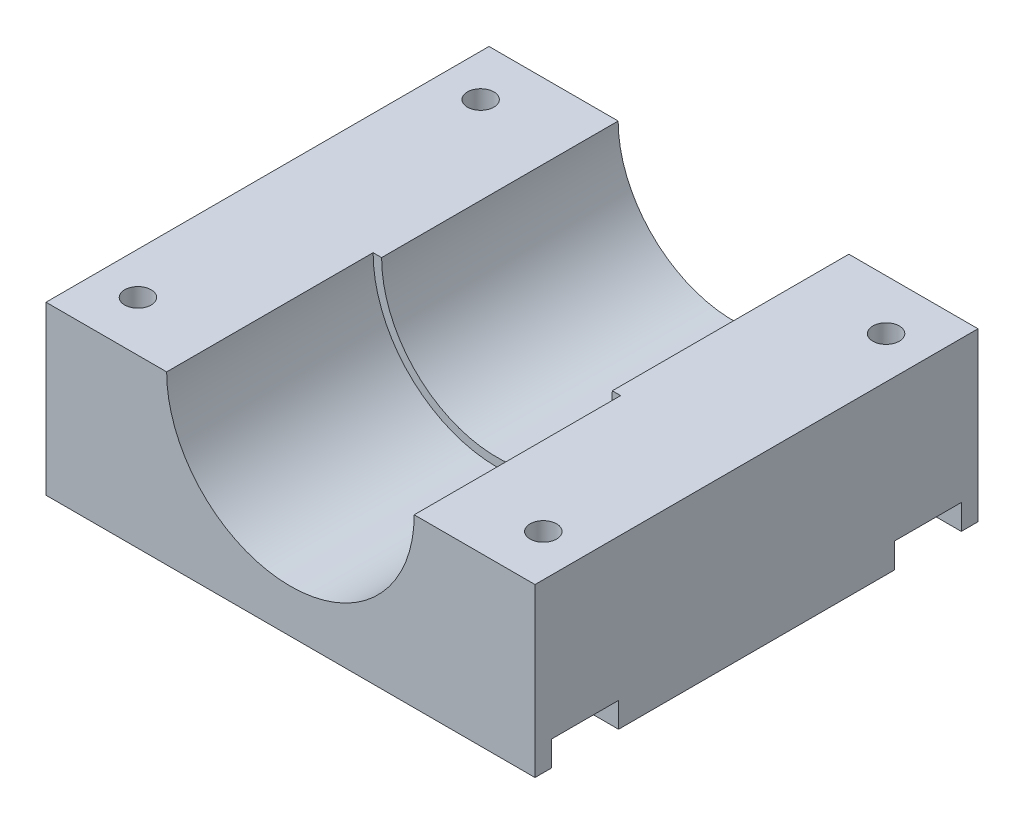
ISO-10303-21;
HEADER;
FILE_DESCRIPTION(('STEP AP214'),'2;1');
FILE_NAME('part.step','',(''),(''),'','','');
FILE_SCHEMA(('AUTOMOTIVE_DESIGN { 1 0 10303 214 1 1 1 1 }'));
ENDSEC;
DATA;
#1=APPLICATION_CONTEXT('core data for automotive mechanical design processes');
#2=APPLICATION_PROTOCOL_DEFINITION('international standard','automotive_design',2000,#1);
#3=PRODUCT_CONTEXT('',#1,'mechanical');
#4=PRODUCT('Part','Part','',(#3));
#5=PRODUCT_RELATED_PRODUCT_CATEGORY('part','',(#4));
#6=PRODUCT_DEFINITION_FORMATION('','',#4);
#7=PRODUCT_DEFINITION_CONTEXT('part definition',#1,'design');
#8=PRODUCT_DEFINITION('design','',#6,#7);
#9=PRODUCT_DEFINITION_SHAPE('','',#8);
#10=(LENGTH_UNIT() NAMED_UNIT(*) SI_UNIT(.MILLI.,.METRE.));
#11=(NAMED_UNIT(*) PLANE_ANGLE_UNIT() SI_UNIT($,.RADIAN.));
#12=(NAMED_UNIT(*) SI_UNIT($,.STERADIAN.) SOLID_ANGLE_UNIT());
#13=UNCERTAINTY_MEASURE_WITH_UNIT(LENGTH_MEASURE(1.E-05),#10,'distance_accuracy_value','');
#14=(GEOMETRIC_REPRESENTATION_CONTEXT(3) GLOBAL_UNCERTAINTY_ASSIGNED_CONTEXT((#13)) GLOBAL_UNIT_ASSIGNED_CONTEXT((#10,
#11,#12)) REPRESENTATION_CONTEXT('',''));
#15=CARTESIAN_POINT('',(0.,0.,0.));
#16=DIRECTION('',(0.,0.,1.));
#17=DIRECTION('',(1.,0.,0.));
#18=AXIS2_PLACEMENT_3D('',#15,#16,#17);
#19=CARTESIAN_POINT('',(4.99999999999999,78.8908045977011,47.));
#20=DIRECTION('',(0.,-1.,0.));
#21=DIRECTION('',(1.,0.,0.));
#22=AXIS2_PLACEMENT_3D('',#19,#20,#21);
#23=CYLINDRICAL_SURFACE('',#22,1.585);
#24=CARTESIAN_POINT('',(5.,6.39080459770115,47.));
#25=DIRECTION('',(0.,-1.,0.));
#26=DIRECTION('',(0.,0.,-1.));
#27=AXIS2_PLACEMENT_3D('',#24,#25,#26);
#28=CIRCLE('',#27,1.585);
#29=CARTESIAN_POINT('',(5.,6.39080459770115,45.415));
#30=VERTEX_POINT('',#29);
#31=EDGE_CURVE('E288',#30,#30,#28,.T.);
#32=ORIENTED_EDGE('',*,*,#31,.F.);
#33=EDGE_LOOP('',(#32));
#34=FACE_BOUND('',#33,.T.);
#35=CARTESIAN_POINT('',(5.,-10.6091954022988,47.));
#36=DIRECTION('',(0.,-1.,0.));
#37=DIRECTION('',(1.,0.,0.));
#38=AXIS2_PLACEMENT_3D('',#35,#36,#37);
#39=CIRCLE('',#38,1.585);
#40=CARTESIAN_POINT('',(6.585,-10.6091954022988,47.));
#41=VERTEX_POINT('',#40);
#42=EDGE_CURVE('E41',#41,#41,#39,.F.);
#43=ORIENTED_EDGE('',*,*,#42,.F.);
#44=EDGE_LOOP('',(#43));
#45=FACE_BOUND('',#44,.T.);
#46=ADVANCED_FACE('F37',(#34,#45),#23,.F.);
#47=CARTESIAN_POINT('',(0.,-13.6091954022989,53.));
#48=DIRECTION('',(0.,1.,0.));
#49=DIRECTION('',(-1.,0.,0.));
#50=AXIS2_PLACEMENT_3D('',#47,#48,#49);
#51=PLANE('',#50);
#52=DIRECTION('',(0.,0.,-1.));
#53=VECTOR('',#52,1.);
#54=CARTESIAN_POINT('',(0.,-13.6091954022989,53.));
#55=LINE('',#54,#53);
#56=CARTESIAN_POINT('',(0.,-13.6091954022989,53.));
#57=VERTEX_POINT('',#56);
#58=CARTESIAN_POINT('',(0.,-13.6091954022988,51.));
#59=VERTEX_POINT('',#58);
#60=EDGE_CURVE('E46',#57,#59,#55,.T.);
#61=ORIENTED_EDGE('',*,*,#60,.T.);
#62=DIRECTION('',(-1.,0.,0.));
#63=VECTOR('',#62,1.);
#64=CARTESIAN_POINT('',(0.,-13.6091954022988,51.));
#65=LINE('',#64,#63);
#66=CARTESIAN_POINT('',(10.,-13.6091954022988,51.));
#67=VERTEX_POINT('',#66);
#68=EDGE_CURVE('E216',#67,#59,#65,.T.);
#69=ORIENTED_EDGE('',*,*,#68,.F.);
#70=DIRECTION('',(0.,0.,1.));
#71=VECTOR('',#70,1.);
#72=CARTESIAN_POINT('',(10.,-13.6091954022988,51.));
#73=LINE('',#72,#71);
#74=CARTESIAN_POINT('',(10.,-13.6091954022988,43.));
#75=VERTEX_POINT('',#74);
#76=EDGE_CURVE('E788',#75,#67,#73,.T.);
#77=ORIENTED_EDGE('',*,*,#76,.F.);
#78=DIRECTION('',(1.,0.,0.));
#79=VECTOR('',#78,1.);
#80=CARTESIAN_POINT('',(0.,-13.6091954022988,43.));
#81=LINE('',#80,#79);
#82=CARTESIAN_POINT('',(0.,-13.6091954022988,43.));
#83=VERTEX_POINT('',#82);
#84=EDGE_CURVE('E790',#83,#75,#81,.T.);
#85=ORIENTED_EDGE('',*,*,#84,.F.);
#86=CARTESIAN_POINT('',(0.,-13.6091954022988,10.));
#87=VERTEX_POINT('',#86);
#88=EDGE_CURVE('E220',#83,#87,#55,.T.);
#89=ORIENTED_EDGE('',*,*,#88,.T.);
#90=DIRECTION('',(1.,0.,0.));
#91=VECTOR('',#90,1.);
#92=CARTESIAN_POINT('',(0.,-13.6091954022988,10.));
#93=LINE('',#92,#91);
#94=CARTESIAN_POINT('',(10.,-13.6091954022988,10.));
#95=VERTEX_POINT('',#94);
#96=EDGE_CURVE('E257',#87,#95,#93,.T.);
#97=ORIENTED_EDGE('',*,*,#96,.T.);
#98=DIRECTION('',(0.,0.,-1.));
#99=VECTOR('',#98,1.);
#100=CARTESIAN_POINT('',(10.,-13.6091954022988,2.));
#101=LINE('',#100,#99);
#102=CARTESIAN_POINT('',(10.,-13.6091954022988,2.));
#103=VERTEX_POINT('',#102);
#104=EDGE_CURVE('E267',#95,#103,#101,.T.);
#105=ORIENTED_EDGE('',*,*,#104,.T.);
#106=DIRECTION('',(-1.,0.,0.));
#107=VECTOR('',#106,1.);
#108=CARTESIAN_POINT('',(0.,-13.6091954022988,2.));
#109=LINE('',#108,#107);
#110=CARTESIAN_POINT('',(0.,-13.6091954022989,2.));
#111=VERTEX_POINT('',#110);
#112=EDGE_CURVE('E264',#103,#111,#109,.T.);
#113=ORIENTED_EDGE('',*,*,#112,.T.);
#114=CARTESIAN_POINT('',(0.,-13.6091954022989,0.));
#115=VERTEX_POINT('',#114);
#116=EDGE_CURVE('E374',#111,#115,#55,.T.);
#117=ORIENTED_EDGE('',*,*,#116,.T.);
#118=DIRECTION('',(1.,0.,0.));
#119=VECTOR('',#118,1.);
#120=CARTESIAN_POINT('',(0.,-13.6091954022989,0.));
#121=LINE('',#120,#119);
#122=CARTESIAN_POINT('',(58.5,-13.6091954022988,0.));
#123=VERTEX_POINT('',#122);
#124=EDGE_CURVE('E357',#115,#123,#121,.T.);
#125=ORIENTED_EDGE('',*,*,#124,.T.);
#126=DIRECTION('',(0.,0.,-1.));
#127=VECTOR('',#126,1.);
#128=CARTESIAN_POINT('',(58.5,-13.6091954022988,53.));
#129=LINE('',#128,#127);
#130=CARTESIAN_POINT('',(58.5,-13.6091954022988,2.));
#131=VERTEX_POINT('',#130);
#132=EDGE_CURVE('E370',#131,#123,#129,.T.);
#133=ORIENTED_EDGE('',*,*,#132,.F.);
#134=DIRECTION('',(1.,0.,0.));
#135=VECTOR('',#134,1.);
#136=CARTESIAN_POINT('',(58.5,-13.6091954022988,2.));
#137=LINE('',#136,#135);
#138=CARTESIAN_POINT('',(48.5,-13.6091954022988,2.));
#139=VERTEX_POINT('',#138);
#140=EDGE_CURVE('E296',#139,#131,#137,.T.);
#141=ORIENTED_EDGE('',*,*,#140,.F.);
#142=DIRECTION('',(0.,0.,-1.));
#143=VECTOR('',#142,1.);
#144=CARTESIAN_POINT('',(48.5,-13.6091954022988,2.));
#145=LINE('',#144,#143);
#146=CARTESIAN_POINT('',(48.5,-13.6091954022988,10.));
#147=VERTEX_POINT('',#146);
#148=EDGE_CURVE('E307',#147,#139,#145,.T.);
#149=ORIENTED_EDGE('',*,*,#148,.F.);
#150=DIRECTION('',(-1.,0.,0.));
#151=VECTOR('',#150,1.);
#152=CARTESIAN_POINT('',(58.5,-13.6091954022988,10.));
#153=LINE('',#152,#151);
#154=CARTESIAN_POINT('',(58.5,-13.6091954022988,10.));
#155=VERTEX_POINT('',#154);
#156=EDGE_CURVE('E291',#155,#147,#153,.T.);
#157=ORIENTED_EDGE('',*,*,#156,.F.);
#158=CARTESIAN_POINT('',(58.5,-13.6091954022988,43.));
#159=VERTEX_POINT('',#158);
#160=EDGE_CURVE('E375',#159,#155,#129,.T.);
#161=ORIENTED_EDGE('',*,*,#160,.F.);
#162=DIRECTION('',(-1.,0.,0.));
#163=VECTOR('',#162,1.);
#164=CARTESIAN_POINT('',(58.5,-13.6091954022988,43.));
#165=LINE('',#164,#163);
#166=CARTESIAN_POINT('',(48.5,-13.6091954022988,43.));
#167=VERTEX_POINT('',#166);
#168=EDGE_CURVE('E231',#159,#167,#165,.T.);
#169=ORIENTED_EDGE('',*,*,#168,.T.);
#170=DIRECTION('',(0.,0.,1.));
#171=VECTOR('',#170,1.);
#172=CARTESIAN_POINT('',(48.5,-13.6091954022988,51.));
#173=LINE('',#172,#171);
#174=CARTESIAN_POINT('',(48.5,-13.6091954022988,51.));
#175=VERTEX_POINT('',#174);
#176=EDGE_CURVE('E241',#167,#175,#173,.T.);
#177=ORIENTED_EDGE('',*,*,#176,.T.);
#178=DIRECTION('',(1.,0.,0.));
#179=VECTOR('',#178,1.);
#180=CARTESIAN_POINT('',(58.5,-13.6091954022988,51.));
#181=LINE('',#180,#179);
#182=CARTESIAN_POINT('',(58.5,-13.6091954022988,51.));
#183=VERTEX_POINT('',#182);
#184=EDGE_CURVE('E238',#175,#183,#181,.T.);
#185=ORIENTED_EDGE('',*,*,#184,.T.);
#186=CARTESIAN_POINT('',(58.5,-13.6091954022988,53.));
#187=VERTEX_POINT('',#186);
#188=EDGE_CURVE('E371',#187,#183,#129,.T.);
#189=ORIENTED_EDGE('',*,*,#188,.F.);
#190=DIRECTION('',(1.,0.,0.));
#191=VECTOR('',#190,1.);
#192=CARTESIAN_POINT('',(0.,-13.6091954022989,53.));
#193=LINE('',#192,#191);
#194=EDGE_CURVE('E345',#57,#187,#193,.T.);
#195=ORIENTED_EDGE('',*,*,#194,.F.);
#196=EDGE_LOOP('',(#61,#69,#77,#85,#89,#97,#105,#113,#117,#125,#133,#141,#149,#157,#161,#169,
#177,#185,#189,#195));
#197=FACE_BOUND('',#196,.T.);
#198=ADVANCED_FACE('F398',(#197),#51,.F.);
#199=CARTESIAN_POINT('',(58.5,-13.6091954022988,53.));
#200=DIRECTION('',(-1.,0.,0.));
#201=DIRECTION('',(0.,0.,1.));
#202=AXIS2_PLACEMENT_3D('',#199,#200,#201);
#203=PLANE('',#202);
#204=DIRECTION('',(0.,-1.,0.));
#205=VECTOR('',#204,1.);
#206=CARTESIAN_POINT('',(58.5,-10.6091954022988,43.));
#207=LINE('',#206,#205);
#208=CARTESIAN_POINT('',(58.5,-10.6091954022988,43.));
#209=VERTEX_POINT('',#208);
#210=EDGE_CURVE('E62',#209,#159,#207,.T.);
#211=ORIENTED_EDGE('',*,*,#210,.T.);
#212=ORIENTED_EDGE('',*,*,#160,.T.);
#213=DIRECTION('',(0.,-1.,0.));
#214=VECTOR('',#213,1.);
#215=CARTESIAN_POINT('',(58.5,-10.6091954022988,10.));
#216=LINE('',#215,#214);
#217=CARTESIAN_POINT('',(58.5,-10.6091954022988,10.));
#218=VERTEX_POINT('',#217);
#219=EDGE_CURVE('E304',#218,#155,#216,.T.);
#220=ORIENTED_EDGE('',*,*,#219,.F.);
#221=DIRECTION('',(0.,0.,1.));
#222=VECTOR('',#221,1.);
#223=CARTESIAN_POINT('',(58.5,-10.6091954022988,2.));
#224=LINE('',#223,#222);
#225=CARTESIAN_POINT('',(58.5,-10.6091954022988,2.));
#226=VERTEX_POINT('',#225);
#227=EDGE_CURVE('E292',#226,#218,#224,.T.);
#228=ORIENTED_EDGE('',*,*,#227,.F.);
#229=DIRECTION('',(0.,-1.,0.));
#230=VECTOR('',#229,1.);
#231=CARTESIAN_POINT('',(58.5,-10.6091954022988,2.));
#232=LINE('',#231,#230);
#233=EDGE_CURVE('E311',#226,#131,#232,.T.);
#234=ORIENTED_EDGE('',*,*,#233,.T.);
#235=ORIENTED_EDGE('',*,*,#132,.T.);
#236=DIRECTION('',(0.,1.,0.));
#237=VECTOR('',#236,1.);
#238=CARTESIAN_POINT('',(58.5,-13.6091954022988,0.));
#239=LINE('',#238,#237);
#240=CARTESIAN_POINT('',(58.5,6.39080459770115,0.));
#241=VERTEX_POINT('',#240);
#242=EDGE_CURVE('E360',#123,#241,#239,.T.);
#243=ORIENTED_EDGE('',*,*,#242,.T.);
#244=DIRECTION('',(0.,0.,-1.));
#245=VECTOR('',#244,1.);
#246=CARTESIAN_POINT('',(58.5,6.39080459770115,53.));
#247=LINE('',#246,#245);
#248=CARTESIAN_POINT('',(58.5,6.39080459770115,53.));
#249=VERTEX_POINT('',#248);
#250=EDGE_CURVE('E367',#249,#241,#247,.T.);
#251=ORIENTED_EDGE('',*,*,#250,.F.);
#252=DIRECTION('',(0.,1.,0.));
#253=VECTOR('',#252,1.);
#254=CARTESIAN_POINT('',(58.5,-13.6091954022988,53.));
#255=LINE('',#254,#253);
#256=EDGE_CURVE('E348',#187,#249,#255,.T.);
#257=ORIENTED_EDGE('',*,*,#256,.F.);
#258=ORIENTED_EDGE('',*,*,#188,.T.);
#259=DIRECTION('',(0.,-1.,0.));
#260=VECTOR('',#259,1.);
#261=CARTESIAN_POINT('',(58.5,-10.6091954022988,51.));
#262=LINE('',#261,#260);
#263=CARTESIAN_POINT('',(58.5,-10.6091954022988,51.));
#264=VERTEX_POINT('',#263);
#265=EDGE_CURVE('E237',#264,#183,#262,.T.);
#266=ORIENTED_EDGE('',*,*,#265,.F.);
#267=DIRECTION('',(0.,0.,-1.));
#268=VECTOR('',#267,1.);
#269=CARTESIAN_POINT('',(58.5,-10.6091954022988,51.));
#270=LINE('',#269,#268);
#271=EDGE_CURVE('E227',#264,#209,#270,.T.);
#272=ORIENTED_EDGE('',*,*,#271,.T.);
#273=EDGE_LOOP('',(#211,#212,#220,#228,#234,#235,#243,#251,#257,#258,#266,#272));
#274=FACE_BOUND('',#273,.T.);
#275=ADVANCED_FACE('F390',(#274),#203,.F.);
#276=CARTESIAN_POINT('',(53.5,78.8908045977011,47.));
#277=DIRECTION('',(0.,-1.,0.));
#278=DIRECTION('',(1.,0.,0.));
#279=AXIS2_PLACEMENT_3D('',#276,#277,#278);
#280=CYLINDRICAL_SURFACE('',#279,1.585);
#281=CARTESIAN_POINT('',(53.5,6.39080459770115,47.));
#282=DIRECTION('',(0.,-1.,0.));
#283=DIRECTION('',(0.,0.,-1.));
#284=AXIS2_PLACEMENT_3D('',#281,#282,#283);
#285=CIRCLE('',#284,1.585);
#286=CARTESIAN_POINT('',(53.5,6.39080459770115,45.415));
#287=VERTEX_POINT('',#286);
#288=EDGE_CURVE('E283',#287,#287,#285,.T.);
#289=ORIENTED_EDGE('',*,*,#288,.F.);
#290=EDGE_LOOP('',(#289));
#291=FACE_BOUND('',#290,.T.);
#292=CARTESIAN_POINT('',(53.5,-10.6091954022988,47.));
#293=DIRECTION('',(0.,-1.,0.));
#294=DIRECTION('',(1.,0.,0.));
#295=AXIS2_PLACEMENT_3D('',#292,#293,#294);
#296=CIRCLE('',#295,1.585);
#297=CARTESIAN_POINT('',(55.085,-10.6091954022988,47.));
#298=VERTEX_POINT('',#297);
#299=EDGE_CURVE('E247',#298,#298,#296,.F.);
#300=ORIENTED_EDGE('',*,*,#299,.F.);
#301=EDGE_LOOP('',(#300));
#302=FACE_BOUND('',#301,.T.);
#303=ADVANCED_FACE('F388',(#291,#302),#280,.F.);
#304=CARTESIAN_POINT('',(0.,-13.6091954022989,53.));
#305=DIRECTION('',(1.,0.,0.));
#306=DIRECTION('',(0.,0.,-1.));
#307=AXIS2_PLACEMENT_3D('',#304,#305,#306);
#308=PLANE('',#307);
#309=DIRECTION('',(0.,0.,-1.));
#310=VECTOR('',#309,1.);
#311=CARTESIAN_POINT('',(0.,-10.6091954022988,51.));
#312=LINE('',#311,#310);
#313=CARTESIAN_POINT('',(0.,-10.6091954022988,51.));
#314=VERTEX_POINT('',#313);
#315=CARTESIAN_POINT('',(0.,-10.6091954022988,43.));
#316=VERTEX_POINT('',#315);
#317=EDGE_CURVE('E209',#314,#316,#312,.T.);
#318=ORIENTED_EDGE('',*,*,#317,.F.);
#319=DIRECTION('',(0.,-1.,0.));
#320=VECTOR('',#319,1.);
#321=CARTESIAN_POINT('',(0.,-10.6091954022988,51.));
#322=LINE('',#321,#320);
#323=EDGE_CURVE('E769',#314,#59,#322,.T.);
#324=ORIENTED_EDGE('',*,*,#323,.T.);
#325=ORIENTED_EDGE('',*,*,#60,.F.);
#326=DIRECTION('',(0.,-1.,0.));
#327=VECTOR('',#326,1.);
#328=CARTESIAN_POINT('',(0.,-13.6091954022989,53.));
#329=LINE('',#328,#327);
#330=CARTESIAN_POINT('',(0.,6.39080459770115,53.));
#331=VERTEX_POINT('',#330);
#332=EDGE_CURVE('E342',#331,#57,#329,.T.);
#333=ORIENTED_EDGE('',*,*,#332,.F.);
#334=DIRECTION('',(0.,0.,-1.));
#335=VECTOR('',#334,1.);
#336=CARTESIAN_POINT('',(0.,6.39080459770115,53.));
#337=LINE('',#336,#335);
#338=CARTESIAN_POINT('',(0.,6.39080459770115,0.));
#339=VERTEX_POINT('',#338);
#340=EDGE_CURVE('E354',#331,#339,#337,.T.);
#341=ORIENTED_EDGE('',*,*,#340,.T.);
#342=DIRECTION('',(0.,-1.,0.));
#343=VECTOR('',#342,1.);
#344=CARTESIAN_POINT('',(0.,-13.6091954022989,0.));
#345=LINE('',#344,#343);
#346=EDGE_CURVE('E339',#339,#115,#345,.T.);
#347=ORIENTED_EDGE('',*,*,#346,.T.);
#348=ORIENTED_EDGE('',*,*,#116,.F.);
#349=DIRECTION('',(0.,-1.,0.));
#350=VECTOR('',#349,1.);
#351=CARTESIAN_POINT('',(0.,-10.6091954022988,2.));
#352=LINE('',#351,#350);
#353=CARTESIAN_POINT('',(0.,-10.6091954022988,2.));
#354=VERTEX_POINT('',#353);
#355=EDGE_CURVE('E263',#354,#111,#352,.T.);
#356=ORIENTED_EDGE('',*,*,#355,.F.);
#357=DIRECTION('',(0.,0.,1.));
#358=VECTOR('',#357,1.);
#359=CARTESIAN_POINT('',(0.,-10.6091954022988,2.));
#360=LINE('',#359,#358);
#361=CARTESIAN_POINT('',(0.,-10.6091954022988,10.));
#362=VERTEX_POINT('',#361);
#363=EDGE_CURVE('E253',#354,#362,#360,.T.);
#364=ORIENTED_EDGE('',*,*,#363,.T.);
#365=DIRECTION('',(0.,-1.,0.));
#366=VECTOR('',#365,1.);
#367=CARTESIAN_POINT('',(0.,-10.6091954022988,10.));
#368=LINE('',#367,#366);
#369=EDGE_CURVE('E272',#362,#87,#368,.T.);
#370=ORIENTED_EDGE('',*,*,#369,.T.);
#371=ORIENTED_EDGE('',*,*,#88,.F.);
#372=DIRECTION('',(0.,-1.,0.));
#373=VECTOR('',#372,1.);
#374=CARTESIAN_POINT('',(0.,-10.6091954022988,43.));
#375=LINE('',#374,#373);
#376=EDGE_CURVE('E204',#316,#83,#375,.T.);
#377=ORIENTED_EDGE('',*,*,#376,.F.);
#378=EDGE_LOOP('',(#318,#324,#325,#333,#341,#347,#348,#356,#364,#370,#371,#377));
#379=FACE_BOUND('',#378,.T.);
#380=ADVANCED_FACE('F39',(#379),#308,.F.);
#381=CARTESIAN_POINT('',(4.99999999999999,78.8908045977011,6.00000000000001));
#382=DIRECTION('',(0.,-1.,0.));
#383=DIRECTION('',(1.,0.,0.));
#384=AXIS2_PLACEMENT_3D('',#381,#382,#383);
#385=CYLINDRICAL_SURFACE('',#384,1.585);
#386=CARTESIAN_POINT('',(5.,6.39080459770115,6.00000000000001));
#387=DIRECTION('',(0.,-1.,0.));
#388=DIRECTION('',(0.,0.,-1.));
#389=AXIS2_PLACEMENT_3D('',#386,#387,#388);
#390=CIRCLE('',#389,1.585);
#391=CARTESIAN_POINT('',(5.,6.39080459770115,4.41500000000001));
#392=VERTEX_POINT('',#391);
#393=EDGE_CURVE('E285',#392,#392,#390,.T.);
#394=ORIENTED_EDGE('',*,*,#393,.F.);
#395=EDGE_LOOP('',(#394));
#396=FACE_BOUND('',#395,.T.);
#397=CARTESIAN_POINT('',(5.,-10.6091954022988,6.00000000000001));
#398=DIRECTION('',(0.,-1.,0.));
#399=DIRECTION('',(1.,0.,0.));
#400=AXIS2_PLACEMENT_3D('',#397,#398,#399);
#401=CIRCLE('',#400,1.585);
#402=CARTESIAN_POINT('',(6.585,-10.6091954022988,6.00000000000001));
#403=VERTEX_POINT('',#402);
#404=EDGE_CURVE('E274',#403,#403,#401,.F.);
#405=ORIENTED_EDGE('',*,*,#404,.F.);
#406=EDGE_LOOP('',(#405));
#407=FACE_BOUND('',#406,.T.);
#408=ADVANCED_FACE('F397',(#396,#407),#385,.F.);
#409=CARTESIAN_POINT('',(0.,6.39080459770115,53.));
#410=DIRECTION('',(0.,-1.,0.));
#411=DIRECTION('',(0.,0.,-1.));
#412=AXIS2_PLACEMENT_3D('',#409,#410,#411);
#413=PLANE('',#412);
#414=ORIENTED_EDGE('',*,*,#31,.T.);
#415=EDGE_LOOP('',(#414));
#416=FACE_BOUND('',#415,.T.);
#417=ORIENTED_EDGE('',*,*,#393,.T.);
#418=EDGE_LOOP('',(#417));
#419=FACE_BOUND('',#418,.T.);
#420=DIRECTION('',(-1.,0.,0.));
#421=VECTOR('',#420,1.);
#422=CARTESIAN_POINT('',(14.4341837523133,6.39080459770115,28.3));
#423=LINE('',#422,#421);
#424=CARTESIAN_POINT('',(15.45,6.39080459770115,28.3));
#425=VERTEX_POINT('',#424);
#426=CARTESIAN_POINT('',(14.4341837523133,6.39080459770115,28.3));
#427=VERTEX_POINT('',#426);
#428=EDGE_CURVE('E331',#425,#427,#423,.T.);
#429=ORIENTED_EDGE('',*,*,#428,.F.);
#430=DIRECTION('',(0.,0.,-1.));
#431=VECTOR('',#430,1.);
#432=CARTESIAN_POINT('',(15.45,6.39080459770115,32.4));
#433=LINE('',#432,#431);
#434=CARTESIAN_POINT('',(15.45,6.39080459770115,0.));
#435=VERTEX_POINT('',#434);
#436=EDGE_CURVE('E322',#425,#435,#433,.T.);
#437=ORIENTED_EDGE('',*,*,#436,.T.);
#438=DIRECTION('',(-1.,0.,0.));
#439=VECTOR('',#438,1.);
#440=CARTESIAN_POINT('',(0.,6.39080459770115,0.));
#441=LINE('',#440,#439);
#442=EDGE_CURVE('E362',#435,#339,#441,.T.);
#443=ORIENTED_EDGE('',*,*,#442,.T.);
#444=ORIENTED_EDGE('',*,*,#340,.F.);
#445=DIRECTION('',(-1.,0.,0.));
#446=VECTOR('',#445,1.);
#447=CARTESIAN_POINT('',(0.,6.39080459770115,53.));
#448=LINE('',#447,#446);
#449=CARTESIAN_POINT('',(14.4341837523133,6.39080459770115,53.));
#450=VERTEX_POINT('',#449);
#451=EDGE_CURVE('E350',#450,#331,#448,.T.);
#452=ORIENTED_EDGE('',*,*,#451,.F.);
#453=DIRECTION('',(0.,0.,1.));
#454=VECTOR('',#453,1.);
#455=CARTESIAN_POINT('',(14.4341837523133,6.39080459770115,28.3));
#456=LINE('',#455,#454);
#457=EDGE_CURVE('E337',#427,#450,#456,.T.);
#458=ORIENTED_EDGE('',*,*,#457,.F.);
#459=EDGE_LOOP('',(#429,#437,#443,#444,#452,#458));
#460=FACE_BOUND('',#459,.T.);
#461=ADVANCED_FACE('F415',(#416,#419,#460),#413,.F.);
#462=CARTESIAN_POINT('',(53.5,6.39080459770115,6.));
#463=DIRECTION('',(0.,-1.,0.));
#464=DIRECTION('',(0.,0.,-1.));
#465=AXIS2_PLACEMENT_3D('',#462,#463,#464);
#466=CIRCLE('',#465,1.585);
#467=CARTESIAN_POINT('',(53.5,6.39080459770115,4.415));
#468=VERTEX_POINT('',#467);
#469=EDGE_CURVE('E280',#468,#468,#466,.T.);
#470=ORIENTED_EDGE('',*,*,#469,.T.);
#471=EDGE_LOOP('',(#470));
#472=FACE_BOUND('',#471,.T.);
#473=ORIENTED_EDGE('',*,*,#288,.T.);
#474=EDGE_LOOP('',(#473));
#475=FACE_BOUND('',#474,.T.);
#476=CARTESIAN_POINT('',(43.05,6.39080459770115,0.));
#477=VERTEX_POINT('',#476);
#478=EDGE_CURVE('E346',#241,#477,#441,.T.);
#479=ORIENTED_EDGE('',*,*,#478,.T.);
#480=DIRECTION('',(0.,0.,-1.));
#481=VECTOR('',#480,1.);
#482=CARTESIAN_POINT('',(43.05,6.39080459770115,32.4));
#483=LINE('',#482,#481);
#484=CARTESIAN_POINT('',(43.05,6.39080459770115,28.3));
#485=VERTEX_POINT('',#484);
#486=EDGE_CURVE('E323',#485,#477,#483,.T.);
#487=ORIENTED_EDGE('',*,*,#486,.F.);
#488=CARTESIAN_POINT('',(44.05,6.39080459770115,28.3));
#489=VERTEX_POINT('',#488);
#490=EDGE_CURVE('E332',#489,#485,#423,.T.);
#491=ORIENTED_EDGE('',*,*,#490,.F.);
#492=DIRECTION('',(0.,0.,1.));
#493=VECTOR('',#492,1.);
#494=CARTESIAN_POINT('',(44.05,6.39080459770115,28.3));
#495=LINE('',#494,#493);
#496=CARTESIAN_POINT('',(44.05,6.39080459770115,53.));
#497=VERTEX_POINT('',#496);
#498=EDGE_CURVE('E335',#489,#497,#495,.T.);
#499=ORIENTED_EDGE('',*,*,#498,.T.);
#500=EDGE_CURVE('E351',#249,#497,#448,.T.);
#501=ORIENTED_EDGE('',*,*,#500,.F.);
#502=ORIENTED_EDGE('',*,*,#250,.T.);
#503=EDGE_LOOP('',(#479,#487,#491,#499,#501,#502));
#504=FACE_BOUND('',#503,.T.);
#505=ADVANCED_FACE('F657',(#472,#475,#504),#413,.F.);
#506=CARTESIAN_POINT('',(0.,0.,53.));
#507=DIRECTION('',(0.,0.,-1.));
#508=DIRECTION('',(-1.,0.,0.));
#509=AXIS2_PLACEMENT_3D('',#506,#507,#508);
#510=PLANE('',#509);
#511=ORIENTED_EDGE('',*,*,#500,.T.);
#512=CARTESIAN_POINT('',(29.2420918761566,6.39080459770115,53.));
#513=DIRECTION('',(0.,0.,1.));
#514=DIRECTION('',(1.,0.,0.));
#515=AXIS2_PLACEMENT_3D('',#512,#513,#514);
#516=CIRCLE('',#515,14.8079081238434);
#517=EDGE_CURVE('E325',#450,#497,#516,.T.);
#518=ORIENTED_EDGE('',*,*,#517,.F.);
#519=ORIENTED_EDGE('',*,*,#451,.T.);
#520=ORIENTED_EDGE('',*,*,#332,.T.);
#521=ORIENTED_EDGE('',*,*,#194,.T.);
#522=ORIENTED_EDGE('',*,*,#256,.T.);
#523=EDGE_LOOP('',(#511,#518,#519,#520,#521,#522));
#524=FACE_BOUND('',#523,.T.);
#525=ADVANCED_FACE('F689',(#524),#510,.F.);
#526=CARTESIAN_POINT('',(0.,0.,0.));
#527=DIRECTION('',(0.,0.,-1.));
#528=DIRECTION('',(-1.,0.,0.));
#529=AXIS2_PLACEMENT_3D('',#526,#527,#528);
#530=PLANE('',#529);
#531=CARTESIAN_POINT('',(29.25,6.39080459770116,0.));
#532=DIRECTION('',(0.,0.,-1.));
#533=DIRECTION('',(-1.,0.,0.));
#534=AXIS2_PLACEMENT_3D('',#531,#532,#533);
#535=CIRCLE('',#534,13.8);
#536=EDGE_CURVE('E314',#477,#435,#535,.T.);
#537=ORIENTED_EDGE('',*,*,#536,.F.);
#538=ORIENTED_EDGE('',*,*,#478,.F.);
#539=ORIENTED_EDGE('',*,*,#242,.F.);
#540=ORIENTED_EDGE('',*,*,#124,.F.);
#541=ORIENTED_EDGE('',*,*,#346,.F.);
#542=ORIENTED_EDGE('',*,*,#442,.F.);
#543=EDGE_LOOP('',(#537,#538,#539,#540,#541,#542));
#544=FACE_BOUND('',#543,.T.);
#545=ADVANCED_FACE('F678',(#544),#530,.T.);
#546=CARTESIAN_POINT('',(29.2420918761566,6.39080459770115,28.3));
#547=DIRECTION('',(0.,0.,1.));
#548=DIRECTION('',(1.,0.,0.));
#549=AXIS2_PLACEMENT_3D('',#546,#547,#548);
#550=CYLINDRICAL_SURFACE('',#549,14.8079081238434);
#551=ORIENTED_EDGE('',*,*,#517,.T.);
#552=ORIENTED_EDGE('',*,*,#498,.F.);
#553=CARTESIAN_POINT('',(29.2420918761566,6.39080459770115,28.3));
#554=DIRECTION('',(0.,0.,1.));
#555=DIRECTION('',(1.,0.,0.));
#556=AXIS2_PLACEMENT_3D('',#553,#554,#555);
#557=CIRCLE('',#556,14.8079081238434);
#558=EDGE_CURVE('E328',#427,#489,#557,.T.);
#559=ORIENTED_EDGE('',*,*,#558,.F.);
#560=ORIENTED_EDGE('',*,*,#457,.T.);
#561=EDGE_LOOP('',(#551,#552,#559,#560));
#562=FACE_BOUND('',#561,.T.);
#563=ADVANCED_FACE('F666',(#562),#550,.F.);
#564=CARTESIAN_POINT('',(29.2420918761566,6.39080459770115,28.3));
#565=DIRECTION('',(0.,0.,1.));
#566=DIRECTION('',(1.,0.,0.));
#567=AXIS2_PLACEMENT_3D('',#564,#565,#566);
#568=PLANE('',#567);
#569=CARTESIAN_POINT('',(29.25,6.39080459770116,28.3));
#570=DIRECTION('',(0.,0.,1.));
#571=DIRECTION('',(1.,0.,0.));
#572=AXIS2_PLACEMENT_3D('',#569,#570,#571);
#573=CIRCLE('',#572,13.8);
#574=EDGE_CURVE('E11',#425,#485,#573,.T.);
#575=ORIENTED_EDGE('',*,*,#574,.F.);
#576=ORIENTED_EDGE('',*,*,#428,.T.);
#577=ORIENTED_EDGE('',*,*,#558,.T.);
#578=ORIENTED_EDGE('',*,*,#490,.T.);
#579=EDGE_LOOP('',(#575,#576,#577,#578));
#580=FACE_BOUND('',#579,.T.);
#581=ADVANCED_FACE('F646',(#580),#568,.T.);
#582=CARTESIAN_POINT('',(29.25,6.39080459770116,32.4));
#583=DIRECTION('',(0.,0.,-1.));
#584=DIRECTION('',(-1.,0.,0.));
#585=AXIS2_PLACEMENT_3D('',#582,#583,#584);
#586=CYLINDRICAL_SURFACE('',#585,13.8);
#587=ORIENTED_EDGE('',*,*,#574,.T.);
#588=ORIENTED_EDGE('',*,*,#486,.T.);
#589=ORIENTED_EDGE('',*,*,#536,.T.);
#590=ORIENTED_EDGE('',*,*,#436,.F.);
#591=EDGE_LOOP('',(#587,#588,#589,#590));
#592=FACE_BOUND('',#591,.T.);
#593=ADVANCED_FACE('F635',(#592),#586,.F.);
#594=CARTESIAN_POINT('',(58.5,-10.6091954022988,2.));
#595=DIRECTION('',(0.,0.,-1.));
#596=DIRECTION('',(-1.,0.,0.));
#597=AXIS2_PLACEMENT_3D('',#594,#595,#596);
#598=PLANE('',#597);
#599=ORIENTED_EDGE('',*,*,#140,.T.);
#600=ORIENTED_EDGE('',*,*,#233,.F.);
#601=DIRECTION('',(1.,0.,0.));
#602=VECTOR('',#601,1.);
#603=CARTESIAN_POINT('',(58.5,-10.6091954022988,2.));
#604=LINE('',#603,#602);
#605=CARTESIAN_POINT('',(48.5,-10.6091954022988,2.));
#606=VERTEX_POINT('',#605);
#607=EDGE_CURVE('E302',#606,#226,#604,.T.);
#608=ORIENTED_EDGE('',*,*,#607,.F.);
#609=DIRECTION('',(0.,-1.,0.));
#610=VECTOR('',#609,1.);
#611=CARTESIAN_POINT('',(48.5,-10.6091954022988,2.));
#612=LINE('',#611,#610);
#613=EDGE_CURVE('E315',#606,#139,#612,.T.);
#614=ORIENTED_EDGE('',*,*,#613,.T.);
#615=EDGE_LOOP('',(#599,#600,#608,#614));
#616=FACE_BOUND('',#615,.T.);
#617=ADVANCED_FACE('F624',(#616),#598,.F.);
#618=CARTESIAN_POINT('',(48.5,-10.6091954022988,2.));
#619=DIRECTION('',(-1.,0.,0.));
#620=DIRECTION('',(0.,-1.,0.));
#621=AXIS2_PLACEMENT_3D('',#618,#619,#620);
#622=PLANE('',#621);
#623=ORIENTED_EDGE('',*,*,#148,.T.);
#624=ORIENTED_EDGE('',*,*,#613,.F.);
#625=DIRECTION('',(0.,0.,-1.));
#626=VECTOR('',#625,1.);
#627=CARTESIAN_POINT('',(48.5,-10.6091954022988,2.));
#628=LINE('',#627,#626);
#629=CARTESIAN_POINT('',(48.5,-10.6091954022988,10.));
#630=VERTEX_POINT('',#629);
#631=EDGE_CURVE('E299',#630,#606,#628,.T.);
#632=ORIENTED_EDGE('',*,*,#631,.F.);
#633=DIRECTION('',(0.,-1.,0.));
#634=VECTOR('',#633,1.);
#635=CARTESIAN_POINT('',(48.5,-10.6091954022988,10.));
#636=LINE('',#635,#634);
#637=EDGE_CURVE('E317',#630,#147,#636,.T.);
#638=ORIENTED_EDGE('',*,*,#637,.T.);
#639=EDGE_LOOP('',(#623,#624,#632,#638));
#640=FACE_BOUND('',#639,.T.);
#641=ADVANCED_FACE('F612',(#640),#622,.F.);
#642=CARTESIAN_POINT('',(58.5,-10.6091954022988,10.));
#643=DIRECTION('',(0.,0.,1.));
#644=DIRECTION('',(1.,0.,0.));
#645=AXIS2_PLACEMENT_3D('',#642,#643,#644);
#646=PLANE('',#645);
#647=ORIENTED_EDGE('',*,*,#156,.T.);
#648=ORIENTED_EDGE('',*,*,#637,.F.);
#649=DIRECTION('',(-1.,0.,0.));
#650=VECTOR('',#649,1.);
#651=CARTESIAN_POINT('',(58.5,-10.6091954022988,10.));
#652=LINE('',#651,#650);
#653=EDGE_CURVE('E295',#218,#630,#652,.T.);
#654=ORIENTED_EDGE('',*,*,#653,.F.);
#655=ORIENTED_EDGE('',*,*,#219,.T.);
#656=EDGE_LOOP('',(#647,#648,#654,#655));
#657=FACE_BOUND('',#656,.T.);
#658=ADVANCED_FACE('F601',(#657),#646,.F.);
#659=CARTESIAN_POINT('',(0.,-10.6091954022989,0.));
#660=DIRECTION('',(0.,-1.,0.));
#661=DIRECTION('',(1.,0.,0.));
#662=AXIS2_PLACEMENT_3D('',#659,#660,#661);
#663=PLANE('',#662);
#664=CARTESIAN_POINT('',(53.5,-10.6091954022988,6.));
#665=DIRECTION('',(0.,-1.,0.));
#666=DIRECTION('',(1.,0.,0.));
#667=AXIS2_PLACEMENT_3D('',#664,#665,#666);
#668=CIRCLE('',#667,1.585);
#669=CARTESIAN_POINT('',(55.085,-10.6091954022988,6.));
#670=VERTEX_POINT('',#669);
#671=EDGE_CURVE('E284',#670,#670,#668,.T.);
#672=ORIENTED_EDGE('',*,*,#671,.F.);
#673=EDGE_LOOP('',(#672));
#674=FACE_BOUND('',#673,.T.);
#675=ORIENTED_EDGE('',*,*,#227,.T.);
#676=ORIENTED_EDGE('',*,*,#653,.T.);
#677=ORIENTED_EDGE('',*,*,#631,.T.);
#678=ORIENTED_EDGE('',*,*,#607,.T.);
#679=EDGE_LOOP('',(#675,#676,#677,#678));
#680=FACE_BOUND('',#679,.T.);
#681=ADVANCED_FACE('F421',(#674,#680),#663,.T.);
#682=CARTESIAN_POINT('',(53.5,78.8908045977011,6.));
#683=DIRECTION('',(0.,-1.,0.));
#684=DIRECTION('',(1.,0.,0.));
#685=AXIS2_PLACEMENT_3D('',#682,#683,#684);
#686=CYLINDRICAL_SURFACE('',#685,1.585);
#687=ORIENTED_EDGE('',*,*,#671,.T.);
#688=EDGE_LOOP('',(#687));
#689=FACE_BOUND('',#688,.T.);
#690=ORIENTED_EDGE('',*,*,#469,.F.);
#691=EDGE_LOOP('',(#690));
#692=FACE_BOUND('',#691,.T.);
#693=ADVANCED_FACE('F417',(#689,#692),#686,.F.);
#694=CARTESIAN_POINT('',(58.5,-10.6091954022989,0.));
#695=DIRECTION('',(0.,-1.,0.));
#696=DIRECTION('',(-1.,0.,0.));
#697=AXIS2_PLACEMENT_3D('',#694,#695,#696);
#698=PLANE('',#697);
#699=ORIENTED_EDGE('',*,*,#363,.F.);
#700=DIRECTION('',(-1.,0.,0.));
#701=VECTOR('',#700,1.);
#702=CARTESIAN_POINT('',(0.,-10.6091954022988,2.));
#703=LINE('',#702,#701);
#704=CARTESIAN_POINT('',(10.,-10.6091954022988,2.));
#705=VERTEX_POINT('',#704);
#706=EDGE_CURVE('E256',#705,#354,#703,.T.);
#707=ORIENTED_EDGE('',*,*,#706,.F.);
#708=DIRECTION('',(0.,0.,-1.));
#709=VECTOR('',#708,1.);
#710=CARTESIAN_POINT('',(10.,-10.6091954022988,2.));
#711=LINE('',#710,#709);
#712=CARTESIAN_POINT('',(10.,-10.6091954022988,10.));
#713=VERTEX_POINT('',#712);
#714=EDGE_CURVE('E259',#713,#705,#711,.T.);
#715=ORIENTED_EDGE('',*,*,#714,.F.);
#716=DIRECTION('',(1.,0.,0.));
#717=VECTOR('',#716,1.);
#718=CARTESIAN_POINT('',(0.,-10.6091954022988,10.));
#719=LINE('',#718,#717);
#720=EDGE_CURVE('E261',#362,#713,#719,.T.);
#721=ORIENTED_EDGE('',*,*,#720,.F.);
#722=EDGE_LOOP('',(#699,#707,#715,#721));
#723=FACE_BOUND('',#722,.T.);
#724=ORIENTED_EDGE('',*,*,#404,.T.);
#725=EDGE_LOOP('',(#724));
#726=FACE_BOUND('',#725,.T.);
#727=ADVANCED_FACE('F420',(#723,#726),#698,.T.);
#728=CARTESIAN_POINT('',(0.,-10.6091954022988,10.));
#729=DIRECTION('',(0.,0.,-1.));
#730=DIRECTION('',(-1.,0.,0.));
#731=AXIS2_PLACEMENT_3D('',#728,#729,#730);
#732=PLANE('',#731);
#733=ORIENTED_EDGE('',*,*,#96,.F.);
#734=ORIENTED_EDGE('',*,*,#369,.F.);
#735=ORIENTED_EDGE('',*,*,#720,.T.);
#736=DIRECTION('',(0.,-1.,0.));
#737=VECTOR('',#736,1.);
#738=CARTESIAN_POINT('',(10.,-10.6091954022988,10.));
#739=LINE('',#738,#737);
#740=EDGE_CURVE('E275',#713,#95,#739,.T.);
#741=ORIENTED_EDGE('',*,*,#740,.T.);
#742=EDGE_LOOP('',(#733,#734,#735,#741));
#743=FACE_BOUND('',#742,.T.);
#744=ADVANCED_FACE('F430',(#743),#732,.T.);
#745=CARTESIAN_POINT('',(10.,-10.6091954022988,2.));
#746=DIRECTION('',(-1.,0.,0.));
#747=DIRECTION('',(0.,-1.,0.));
#748=AXIS2_PLACEMENT_3D('',#745,#746,#747);
#749=PLANE('',#748);
#750=ORIENTED_EDGE('',*,*,#104,.F.);
#751=ORIENTED_EDGE('',*,*,#740,.F.);
#752=ORIENTED_EDGE('',*,*,#714,.T.);
#753=DIRECTION('',(0.,-1.,0.));
#754=VECTOR('',#753,1.);
#755=CARTESIAN_POINT('',(10.,-10.6091954022988,2.));
#756=LINE('',#755,#754);
#757=EDGE_CURVE('E277',#705,#103,#756,.T.);
#758=ORIENTED_EDGE('',*,*,#757,.T.);
#759=EDGE_LOOP('',(#750,#751,#752,#758));
#760=FACE_BOUND('',#759,.T.);
#761=ADVANCED_FACE('F426',(#760),#749,.T.);
#762=CARTESIAN_POINT('',(0.,-10.6091954022988,2.));
#763=DIRECTION('',(0.,0.,1.));
#764=DIRECTION('',(1.,0.,0.));
#765=AXIS2_PLACEMENT_3D('',#762,#763,#764);
#766=PLANE('',#765);
#767=ORIENTED_EDGE('',*,*,#112,.F.);
#768=ORIENTED_EDGE('',*,*,#757,.F.);
#769=ORIENTED_EDGE('',*,*,#706,.T.);
#770=ORIENTED_EDGE('',*,*,#355,.T.);
#771=EDGE_LOOP('',(#767,#768,#769,#770));
#772=FACE_BOUND('',#771,.T.);
#773=ADVANCED_FACE('F423',(#772),#766,.T.);
#774=CARTESIAN_POINT('',(0.,-10.6091954022989,53.));
#775=DIRECTION('',(0.,-1.,0.));
#776=DIRECTION('',(1.,0.,0.));
#777=AXIS2_PLACEMENT_3D('',#774,#775,#776);
#778=PLANE('',#777);
#779=ORIENTED_EDGE('',*,*,#271,.F.);
#780=DIRECTION('',(1.,0.,0.));
#781=VECTOR('',#780,1.);
#782=CARTESIAN_POINT('',(58.5,-10.6091954022988,51.));
#783=LINE('',#782,#781);
#784=CARTESIAN_POINT('',(48.5,-10.6091954022988,51.));
#785=VERTEX_POINT('',#784);
#786=EDGE_CURVE('E230',#785,#264,#783,.T.);
#787=ORIENTED_EDGE('',*,*,#786,.F.);
#788=DIRECTION('',(0.,0.,1.));
#789=VECTOR('',#788,1.);
#790=CARTESIAN_POINT('',(48.5,-10.6091954022988,51.));
#791=LINE('',#790,#789);
#792=CARTESIAN_POINT('',(48.5,-10.6091954022988,43.));
#793=VERTEX_POINT('',#792);
#794=EDGE_CURVE('E233',#793,#785,#791,.T.);
#795=ORIENTED_EDGE('',*,*,#794,.F.);
#796=DIRECTION('',(-1.,0.,0.));
#797=VECTOR('',#796,1.);
#798=CARTESIAN_POINT('',(58.5,-10.6091954022988,43.));
#799=LINE('',#798,#797);
#800=EDGE_CURVE('E235',#209,#793,#799,.T.);
#801=ORIENTED_EDGE('',*,*,#800,.F.);
#802=EDGE_LOOP('',(#779,#787,#795,#801));
#803=FACE_BOUND('',#802,.T.);
#804=ORIENTED_EDGE('',*,*,#299,.T.);
#805=EDGE_LOOP('',(#804));
#806=FACE_BOUND('',#805,.T.);
#807=ADVANCED_FACE('F386',(#803,#806),#778,.T.);
#808=CARTESIAN_POINT('',(58.5,-10.6091954022988,43.));
#809=DIRECTION('',(0.,0.,1.));
#810=DIRECTION('',(1.,0.,0.));
#811=AXIS2_PLACEMENT_3D('',#808,#809,#810);
#812=PLANE('',#811);
#813=ORIENTED_EDGE('',*,*,#168,.F.);
#814=ORIENTED_EDGE('',*,*,#210,.F.);
#815=ORIENTED_EDGE('',*,*,#800,.T.);
#816=DIRECTION('',(0.,-1.,0.));
#817=VECTOR('',#816,1.);
#818=CARTESIAN_POINT('',(48.5,-10.6091954022988,43.));
#819=LINE('',#818,#817);
#820=EDGE_CURVE('E248',#793,#167,#819,.T.);
#821=ORIENTED_EDGE('',*,*,#820,.T.);
#822=EDGE_LOOP('',(#813,#814,#815,#821));
#823=FACE_BOUND('',#822,.T.);
#824=ADVANCED_FACE('F445',(#823),#812,.T.);
#825=CARTESIAN_POINT('',(48.5,-10.6091954022988,51.));
#826=DIRECTION('',(1.,0.,0.));
#827=DIRECTION('',(0.,1.,0.));
#828=AXIS2_PLACEMENT_3D('',#825,#826,#827);
#829=PLANE('',#828);
#830=ORIENTED_EDGE('',*,*,#176,.F.);
#831=ORIENTED_EDGE('',*,*,#820,.F.);
#832=ORIENTED_EDGE('',*,*,#794,.T.);
#833=DIRECTION('',(0.,-1.,0.));
#834=VECTOR('',#833,1.);
#835=CARTESIAN_POINT('',(48.5,-10.6091954022988,51.));
#836=LINE('',#835,#834);
#837=EDGE_CURVE('E250',#785,#175,#836,.T.);
#838=ORIENTED_EDGE('',*,*,#837,.T.);
#839=EDGE_LOOP('',(#830,#831,#832,#838));
#840=FACE_BOUND('',#839,.T.);
#841=ADVANCED_FACE('F441',(#840),#829,.T.);
#842=CARTESIAN_POINT('',(58.5,-10.6091954022988,51.));
#843=DIRECTION('',(0.,0.,-1.));
#844=DIRECTION('',(-1.,0.,0.));
#845=AXIS2_PLACEMENT_3D('',#842,#843,#844);
#846=PLANE('',#845);
#847=ORIENTED_EDGE('',*,*,#184,.F.);
#848=ORIENTED_EDGE('',*,*,#837,.F.);
#849=ORIENTED_EDGE('',*,*,#786,.T.);
#850=ORIENTED_EDGE('',*,*,#265,.T.);
#851=EDGE_LOOP('',(#847,#848,#849,#850));
#852=FACE_BOUND('',#851,.T.);
#853=ADVANCED_FACE('F438',(#852),#846,.T.);
#854=CARTESIAN_POINT('',(58.5,-10.6091954022989,53.));
#855=DIRECTION('',(0.,-1.,0.));
#856=DIRECTION('',(-1.,0.,0.));
#857=AXIS2_PLACEMENT_3D('',#854,#855,#856);
#858=PLANE('',#857);
#859=ORIENTED_EDGE('',*,*,#317,.T.);
#860=DIRECTION('',(1.,0.,0.));
#861=VECTOR('',#860,1.);
#862=CARTESIAN_POINT('',(0.,-10.6091954022988,43.));
#863=LINE('',#862,#861);
#864=CARTESIAN_POINT('',(10.,-10.6091954022988,43.));
#865=VERTEX_POINT('',#864);
#866=EDGE_CURVE('E200',#316,#865,#863,.T.);
#867=ORIENTED_EDGE('',*,*,#866,.T.);
#868=DIRECTION('',(0.,0.,1.));
#869=VECTOR('',#868,1.);
#870=CARTESIAN_POINT('',(10.,-10.6091954022988,51.));
#871=LINE('',#870,#869);
#872=CARTESIAN_POINT('',(10.,-10.6091954022988,51.));
#873=VERTEX_POINT('',#872);
#874=EDGE_CURVE('E208',#865,#873,#871,.T.);
#875=ORIENTED_EDGE('',*,*,#874,.T.);
#876=DIRECTION('',(-1.,0.,0.));
#877=VECTOR('',#876,1.);
#878=CARTESIAN_POINT('',(0.,-10.6091954022988,51.));
#879=LINE('',#878,#877);
#880=EDGE_CURVE('E54',#873,#314,#879,.T.);
#881=ORIENTED_EDGE('',*,*,#880,.T.);
#882=EDGE_LOOP('',(#859,#867,#875,#881));
#883=FACE_BOUND('',#882,.T.);
#884=ORIENTED_EDGE('',*,*,#42,.T.);
#885=EDGE_LOOP('',(#884));
#886=FACE_BOUND('',#885,.T.);
#887=ADVANCED_FACE('F212',(#883,#886),#858,.T.);
#888=CARTESIAN_POINT('',(0.,-10.6091954022988,51.));
#889=DIRECTION('',(0.,0.,1.));
#890=DIRECTION('',(1.,0.,0.));
#891=AXIS2_PLACEMENT_3D('',#888,#889,#890);
#892=PLANE('',#891);
#893=ORIENTED_EDGE('',*,*,#68,.T.);
#894=ORIENTED_EDGE('',*,*,#323,.F.);
#895=ORIENTED_EDGE('',*,*,#880,.F.);
#896=DIRECTION('',(0.,-1.,0.));
#897=VECTOR('',#896,1.);
#898=CARTESIAN_POINT('',(10.,-10.6091954022988,51.));
#899=LINE('',#898,#897);
#900=EDGE_CURVE('E222',#873,#67,#899,.T.);
#901=ORIENTED_EDGE('',*,*,#900,.T.);
#902=EDGE_LOOP('',(#893,#894,#895,#901));
#903=FACE_BOUND('',#902,.T.);
#904=ADVANCED_FACE('F457',(#903),#892,.F.);
#905=CARTESIAN_POINT('',(10.,-10.6091954022988,51.));
#906=DIRECTION('',(1.,0.,0.));
#907=DIRECTION('',(0.,1.,0.));
#908=AXIS2_PLACEMENT_3D('',#905,#906,#907);
#909=PLANE('',#908);
#910=ORIENTED_EDGE('',*,*,#76,.T.);
#911=ORIENTED_EDGE('',*,*,#900,.F.);
#912=ORIENTED_EDGE('',*,*,#874,.F.);
#913=DIRECTION('',(0.,-1.,0.));
#914=VECTOR('',#913,1.);
#915=CARTESIAN_POINT('',(10.,-10.6091954022988,43.));
#916=LINE('',#915,#914);
#917=EDGE_CURVE('E206',#865,#75,#916,.T.);
#918=ORIENTED_EDGE('',*,*,#917,.T.);
#919=EDGE_LOOP('',(#910,#911,#912,#918));
#920=FACE_BOUND('',#919,.T.);
#921=ADVANCED_FACE('F454',(#920),#909,.F.);
#922=CARTESIAN_POINT('',(0.,-10.6091954022988,43.));
#923=DIRECTION('',(0.,0.,-1.));
#924=DIRECTION('',(-1.,0.,0.));
#925=AXIS2_PLACEMENT_3D('',#922,#923,#924);
#926=PLANE('',#925);
#927=ORIENTED_EDGE('',*,*,#84,.T.);
#928=ORIENTED_EDGE('',*,*,#917,.F.);
#929=ORIENTED_EDGE('',*,*,#866,.F.);
#930=ORIENTED_EDGE('',*,*,#376,.T.);
#931=EDGE_LOOP('',(#927,#928,#929,#930));
#932=FACE_BOUND('',#931,.T.);
#933=ADVANCED_FACE('F202',(#932),#926,.F.);
#934=CLOSED_SHELL('',(#46,#198,#275,#303,#380,#408,#461,#505,#525,#545,#563,#581,#593,#617,#641,
#658,#681,#693,#727,#744,#761,#773,#807,#824,#841,#853,#887,#904,#921,#933));
#935=MANIFOLD_SOLID_BREP('B2',#934);
#936=ADVANCED_BREP_SHAPE_REPRESENTATION('',(#18,#935),#14);
#937=SHAPE_DEFINITION_REPRESENTATION(#9,#936);
ENDSEC;
END-ISO-10303-21;
